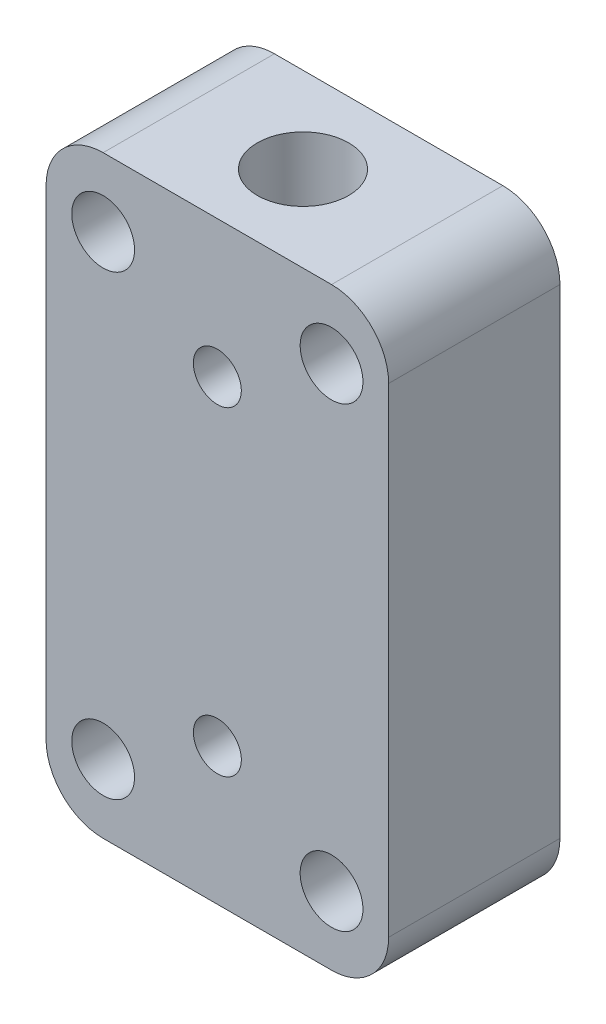
ISO-10303-21;
HEADER;
FILE_DESCRIPTION(('STEP AP214'),'2;1');
FILE_NAME('part.step','',(''),(''),'','','');
FILE_SCHEMA(('AUTOMOTIVE_DESIGN { 1 0 10303 214 1 1 1 1 }'));
ENDSEC;
DATA;
#1=APPLICATION_CONTEXT('core data for automotive mechanical design processes');
#2=APPLICATION_PROTOCOL_DEFINITION('international standard','automotive_design',2000,#1);
#3=PRODUCT_CONTEXT('',#1,'mechanical');
#4=PRODUCT('Part','Part','',(#3));
#5=PRODUCT_RELATED_PRODUCT_CATEGORY('part','',(#4));
#6=PRODUCT_DEFINITION_FORMATION('','',#4);
#7=PRODUCT_DEFINITION_CONTEXT('part definition',#1,'design');
#8=PRODUCT_DEFINITION('design','',#6,#7);
#9=PRODUCT_DEFINITION_SHAPE('','',#8);
#10=(LENGTH_UNIT() NAMED_UNIT(*) SI_UNIT(.MILLI.,.METRE.));
#11=(NAMED_UNIT(*) PLANE_ANGLE_UNIT() SI_UNIT($,.RADIAN.));
#12=(NAMED_UNIT(*) SI_UNIT($,.STERADIAN.) SOLID_ANGLE_UNIT());
#13=UNCERTAINTY_MEASURE_WITH_UNIT(LENGTH_MEASURE(1.E-05),#10,'distance_accuracy_value','');
#14=(GEOMETRIC_REPRESENTATION_CONTEXT(3) GLOBAL_UNCERTAINTY_ASSIGNED_CONTEXT((#13)) GLOBAL_UNIT_ASSIGNED_CONTEXT((#10,
#11,#12)) REPRESENTATION_CONTEXT('',''));
#15=CARTESIAN_POINT('',(0.,0.,0.));
#16=DIRECTION('',(0.,0.,1.));
#17=DIRECTION('',(1.,0.,0.));
#18=AXIS2_PLACEMENT_3D('',#15,#16,#17);
#19=CARTESIAN_POINT('',(0.,0.,15.));
#20=DIRECTION('',(1.,0.,0.));
#21=DIRECTION('',(0.,0.,-1.));
#22=AXIS2_PLACEMENT_3D('',#19,#20,#21);
#23=PLANE('',#22);
#24=DIRECTION('',(0.,-1.,0.));
#25=VECTOR('',#24,1.);
#26=CARTESIAN_POINT('',(0.,0.,0.));
#27=LINE('',#26,#25);
#28=CARTESIAN_POINT('',(0.,47.,0.));
#29=VERTEX_POINT('',#28);
#30=CARTESIAN_POINT('',(0.,5.,0.));
#31=VERTEX_POINT('',#30);
#32=EDGE_CURVE('E134',#29,#31,#27,.T.);
#33=ORIENTED_EDGE('',*,*,#32,.T.);
#34=DIRECTION('',(0.,0.,-1.));
#35=VECTOR('',#34,1.);
#36=CARTESIAN_POINT('',(0.,5.,15.));
#37=LINE('',#36,#35);
#38=CARTESIAN_POINT('',(0.,5.,15.));
#39=VERTEX_POINT('',#38);
#40=EDGE_CURVE('E161',#31,#39,#37,.F.);
#41=ORIENTED_EDGE('',*,*,#40,.T.);
#42=DIRECTION('',(0.,-1.,0.));
#43=VECTOR('',#42,1.);
#44=CARTESIAN_POINT('',(0.,0.,15.));
#45=LINE('',#44,#43);
#46=CARTESIAN_POINT('',(0.,47.,15.));
#47=VERTEX_POINT('',#46);
#48=EDGE_CURVE('E132',#47,#39,#45,.T.);
#49=ORIENTED_EDGE('',*,*,#48,.F.);
#50=DIRECTION('',(0.,0.,-1.));
#51=VECTOR('',#50,1.);
#52=CARTESIAN_POINT('',(0.,47.,15.));
#53=LINE('',#52,#51);
#54=EDGE_CURVE('E158',#47,#29,#53,.T.);
#55=ORIENTED_EDGE('',*,*,#54,.T.);
#56=EDGE_LOOP('',(#33,#41,#49,#55));
#57=FACE_BOUND('',#56,.T.);
#58=ADVANCED_FACE('F33',(#57),#23,.F.);
#59=CARTESIAN_POINT('',(0.,0.,15.));
#60=DIRECTION('',(0.,1.,0.));
#61=DIRECTION('',(0.,0.,1.));
#62=AXIS2_PLACEMENT_3D('',#59,#60,#61);
#63=PLANE('',#62);
#64=CARTESIAN_POINT('',(15.,0.,7.5));
#65=DIRECTION('',(0.,1.,0.));
#66=DIRECTION('',(0.,0.,1.));
#67=AXIS2_PLACEMENT_3D('',#64,#65,#66);
#68=CIRCLE('',#67,4.);
#69=CARTESIAN_POINT('',(15.,0.,11.5));
#70=VERTEX_POINT('',#69);
#71=EDGE_CURVE('E141',#70,#70,#68,.T.);
#72=ORIENTED_EDGE('',*,*,#71,.T.);
#73=EDGE_LOOP('',(#72));
#74=FACE_BOUND('',#73,.T.);
#75=DIRECTION('',(1.,0.,0.));
#76=VECTOR('',#75,1.);
#77=CARTESIAN_POINT('',(0.,0.,0.));
#78=LINE('',#77,#76);
#79=CARTESIAN_POINT('',(5.,0.,0.));
#80=VERTEX_POINT('',#79);
#81=CARTESIAN_POINT('',(25.,0.,0.));
#82=VERTEX_POINT('',#81);
#83=EDGE_CURVE('E130',#80,#82,#78,.T.);
#84=ORIENTED_EDGE('',*,*,#83,.T.);
#85=DIRECTION('',(0.,0.,-1.));
#86=VECTOR('',#85,1.);
#87=CARTESIAN_POINT('',(25.,0.,15.));
#88=LINE('',#87,#86);
#89=CARTESIAN_POINT('',(25.,0.,15.));
#90=VERTEX_POINT('',#89);
#91=EDGE_CURVE('E109',#82,#90,#88,.F.);
#92=ORIENTED_EDGE('',*,*,#91,.T.);
#93=DIRECTION('',(1.,0.,0.));
#94=VECTOR('',#93,1.);
#95=CARTESIAN_POINT('',(0.,0.,15.));
#96=LINE('',#95,#94);
#97=CARTESIAN_POINT('',(5.,0.,15.));
#98=VERTEX_POINT('',#97);
#99=EDGE_CURVE('E235',#98,#90,#96,.T.);
#100=ORIENTED_EDGE('',*,*,#99,.F.);
#101=DIRECTION('',(0.,0.,-1.));
#102=VECTOR('',#101,1.);
#103=CARTESIAN_POINT('',(5.,0.,15.));
#104=LINE('',#103,#102);
#105=EDGE_CURVE('E114',#98,#80,#104,.T.);
#106=ORIENTED_EDGE('',*,*,#105,.T.);
#107=EDGE_LOOP('',(#84,#92,#100,#106));
#108=FACE_BOUND('',#107,.T.);
#109=ADVANCED_FACE('F203',(#74,#108),#63,.F.);
#110=CARTESIAN_POINT('',(30.,0.,15.));
#111=DIRECTION('',(-1.,0.,0.));
#112=DIRECTION('',(0.,0.,1.));
#113=AXIS2_PLACEMENT_3D('',#110,#111,#112);
#114=PLANE('',#113);
#115=DIRECTION('',(0.,1.,0.));
#116=VECTOR('',#115,1.);
#117=CARTESIAN_POINT('',(30.,0.,15.));
#118=LINE('',#117,#116);
#119=CARTESIAN_POINT('',(30.,5.,15.));
#120=VERTEX_POINT('',#119);
#121=CARTESIAN_POINT('',(30.,47.,15.));
#122=VERTEX_POINT('',#121);
#123=EDGE_CURVE('E123',#120,#122,#118,.T.);
#124=ORIENTED_EDGE('',*,*,#123,.F.);
#125=DIRECTION('',(0.,0.,-1.));
#126=VECTOR('',#125,1.);
#127=CARTESIAN_POINT('',(30.,5.,15.));
#128=LINE('',#127,#126);
#129=CARTESIAN_POINT('',(30.,5.,0.));
#130=VERTEX_POINT('',#129);
#131=EDGE_CURVE('E108',#120,#130,#128,.T.);
#132=ORIENTED_EDGE('',*,*,#131,.T.);
#133=DIRECTION('',(0.,1.,0.));
#134=VECTOR('',#133,1.);
#135=CARTESIAN_POINT('',(30.,0.,0.));
#136=LINE('',#135,#134);
#137=CARTESIAN_POINT('',(30.,47.,0.));
#138=VERTEX_POINT('',#137);
#139=EDGE_CURVE('E121',#130,#138,#136,.T.);
#140=ORIENTED_EDGE('',*,*,#139,.T.);
#141=DIRECTION('',(0.,0.,-1.));
#142=VECTOR('',#141,1.);
#143=CARTESIAN_POINT('',(30.,47.,15.));
#144=LINE('',#143,#142);
#145=EDGE_CURVE('E125',#138,#122,#144,.F.);
#146=ORIENTED_EDGE('',*,*,#145,.T.);
#147=EDGE_LOOP('',(#124,#132,#140,#146));
#148=FACE_BOUND('',#147,.T.);
#149=ADVANCED_FACE('F120',(#148),#114,.F.);
#150=CARTESIAN_POINT('',(0.,52.,15.));
#151=DIRECTION('',(0.,-1.,0.));
#152=DIRECTION('',(0.,0.,-1.));
#153=AXIS2_PLACEMENT_3D('',#150,#151,#152);
#154=PLANE('',#153);
#155=CARTESIAN_POINT('',(15.,52.,7.5));
#156=DIRECTION('',(0.,-1.,0.));
#157=DIRECTION('',(0.,0.,-1.));
#158=AXIS2_PLACEMENT_3D('',#155,#156,#157);
#159=CIRCLE('',#158,4.);
#160=CARTESIAN_POINT('',(15.,52.,3.5));
#161=VERTEX_POINT('',#160);
#162=EDGE_CURVE('E138',#161,#161,#159,.T.);
#163=ORIENTED_EDGE('',*,*,#162,.T.);
#164=EDGE_LOOP('',(#163));
#165=FACE_BOUND('',#164,.T.);
#166=DIRECTION('',(-1.,0.,0.));
#167=VECTOR('',#166,1.);
#168=CARTESIAN_POINT('',(0.,52.,0.));
#169=LINE('',#168,#167);
#170=CARTESIAN_POINT('',(25.,52.,0.));
#171=VERTEX_POINT('',#170);
#172=CARTESIAN_POINT('',(5.,52.,0.));
#173=VERTEX_POINT('',#172);
#174=EDGE_CURVE('E129',#171,#173,#169,.T.);
#175=ORIENTED_EDGE('',*,*,#174,.T.);
#176=DIRECTION('',(0.,0.,-1.));
#177=VECTOR('',#176,1.);
#178=CARTESIAN_POINT('',(5.,52.,15.));
#179=LINE('',#178,#177);
#180=CARTESIAN_POINT('',(5.,52.,15.));
#181=VERTEX_POINT('',#180);
#182=EDGE_CURVE('E11',#173,#181,#179,.F.);
#183=ORIENTED_EDGE('',*,*,#182,.T.);
#184=DIRECTION('',(-1.,0.,0.));
#185=VECTOR('',#184,1.);
#186=CARTESIAN_POINT('',(0.,52.,15.));
#187=LINE('',#186,#185);
#188=CARTESIAN_POINT('',(25.,52.,15.));
#189=VERTEX_POINT('',#188);
#190=EDGE_CURVE('E142',#189,#181,#187,.T.);
#191=ORIENTED_EDGE('',*,*,#190,.F.);
#192=DIRECTION('',(0.,0.,-1.));
#193=VECTOR('',#192,1.);
#194=CARTESIAN_POINT('',(25.,52.,15.));
#195=LINE('',#194,#193);
#196=EDGE_CURVE('E46',#189,#171,#195,.T.);
#197=ORIENTED_EDGE('',*,*,#196,.T.);
#198=EDGE_LOOP('',(#175,#183,#191,#197));
#199=FACE_BOUND('',#198,.T.);
#200=ADVANCED_FACE('F246',(#165,#199),#154,.F.);
#201=CARTESIAN_POINT('',(0.,0.,15.));
#202=DIRECTION('',(0.,0.,-1.));
#203=DIRECTION('',(-1.,0.,0.));
#204=AXIS2_PLACEMENT_3D('',#201,#202,#203);
#205=PLANE('',#204);
#206=CARTESIAN_POINT('',(15.,12.,15.));
#207=DIRECTION('',(0.,0.,1.));
#208=DIRECTION('',(-1.,0.,0.));
#209=AXIS2_PLACEMENT_3D('',#206,#207,#208);
#210=CIRCLE('',#209,2.1);
#211=CARTESIAN_POINT('',(12.9,12.,15.));
#212=VERTEX_POINT('',#211);
#213=EDGE_CURVE('E292',#212,#212,#210,.T.);
#214=ORIENTED_EDGE('',*,*,#213,.F.);
#215=EDGE_LOOP('',(#214));
#216=FACE_BOUND('',#215,.T.);
#217=CARTESIAN_POINT('',(15.,40.,15.));
#218=DIRECTION('',(0.,0.,1.));
#219=DIRECTION('',(1.,0.,0.));
#220=AXIS2_PLACEMENT_3D('',#217,#218,#219);
#221=CIRCLE('',#220,2.1);
#222=CARTESIAN_POINT('',(17.1,40.,15.));
#223=VERTEX_POINT('',#222);
#224=EDGE_CURVE('E170',#223,#223,#221,.T.);
#225=ORIENTED_EDGE('',*,*,#224,.F.);
#226=EDGE_LOOP('',(#225));
#227=FACE_BOUND('',#226,.T.);
#228=CARTESIAN_POINT('',(25.,46.,15.));
#229=DIRECTION('',(0.,0.,1.));
#230=DIRECTION('',(-1.,0.,0.));
#231=AXIS2_PLACEMENT_3D('',#228,#229,#230);
#232=CIRCLE('',#231,2.75);
#233=CARTESIAN_POINT('',(22.25,46.,15.));
#234=VERTEX_POINT('',#233);
#235=EDGE_CURVE('E286',#234,#234,#232,.T.);
#236=ORIENTED_EDGE('',*,*,#235,.F.);
#237=EDGE_LOOP('',(#236));
#238=FACE_BOUND('',#237,.T.);
#239=CARTESIAN_POINT('',(25.,6.00000000000001,15.));
#240=DIRECTION('',(0.,0.,1.));
#241=DIRECTION('',(1.,0.,0.));
#242=AXIS2_PLACEMENT_3D('',#239,#240,#241);
#243=CIRCLE('',#242,2.75);
#244=CARTESIAN_POINT('',(27.75,6.00000000000001,15.));
#245=VERTEX_POINT('',#244);
#246=EDGE_CURVE('E282',#245,#245,#243,.T.);
#247=ORIENTED_EDGE('',*,*,#246,.F.);
#248=EDGE_LOOP('',(#247));
#249=FACE_BOUND('',#248,.T.);
#250=CARTESIAN_POINT('',(5.,6.00000000000001,15.));
#251=DIRECTION('',(0.,0.,1.));
#252=DIRECTION('',(-1.,0.,0.));
#253=AXIS2_PLACEMENT_3D('',#250,#251,#252);
#254=CIRCLE('',#253,2.75);
#255=CARTESIAN_POINT('',(2.25,6.00000000000001,15.));
#256=VERTEX_POINT('',#255);
#257=EDGE_CURVE('E169',#256,#256,#254,.T.);
#258=ORIENTED_EDGE('',*,*,#257,.F.);
#259=EDGE_LOOP('',(#258));
#260=FACE_BOUND('',#259,.T.);
#261=CARTESIAN_POINT('',(5.,46.,15.));
#262=DIRECTION('',(0.,0.,1.));
#263=DIRECTION('',(1.,0.,0.));
#264=AXIS2_PLACEMENT_3D('',#261,#262,#263);
#265=CIRCLE('',#264,2.75);
#266=CARTESIAN_POINT('',(7.75,46.,15.));
#267=VERTEX_POINT('',#266);
#268=EDGE_CURVE('E274',#267,#267,#265,.T.);
#269=ORIENTED_EDGE('',*,*,#268,.F.);
#270=EDGE_LOOP('',(#269));
#271=FACE_BOUND('',#270,.T.);
#272=ORIENTED_EDGE('',*,*,#99,.T.);
#273=CARTESIAN_POINT('',(25.,5.,15.));
#274=DIRECTION('',(0.,0.,-1.));
#275=DIRECTION('',(-1.,0.,0.));
#276=AXIS2_PLACEMENT_3D('',#273,#274,#275);
#277=CIRCLE('',#276,5.);
#278=EDGE_CURVE('E156',#90,#120,#277,.F.);
#279=ORIENTED_EDGE('',*,*,#278,.T.);
#280=ORIENTED_EDGE('',*,*,#123,.T.);
#281=CARTESIAN_POINT('',(25.,47.,15.));
#282=DIRECTION('',(0.,0.,-1.));
#283=DIRECTION('',(-1.,0.,0.));
#284=AXIS2_PLACEMENT_3D('',#281,#282,#283);
#285=CIRCLE('',#284,5.);
#286=EDGE_CURVE('E59',#122,#189,#285,.F.);
#287=ORIENTED_EDGE('',*,*,#286,.T.);
#288=ORIENTED_EDGE('',*,*,#190,.T.);
#289=CARTESIAN_POINT('',(5.,47.,15.));
#290=DIRECTION('',(0.,0.,-1.));
#291=DIRECTION('',(-1.,0.,0.));
#292=AXIS2_PLACEMENT_3D('',#289,#290,#291);
#293=CIRCLE('',#292,5.);
#294=EDGE_CURVE('E152',#181,#47,#293,.F.);
#295=ORIENTED_EDGE('',*,*,#294,.T.);
#296=ORIENTED_EDGE('',*,*,#48,.T.);
#297=CARTESIAN_POINT('',(5.,5.,15.));
#298=DIRECTION('',(0.,0.,-1.));
#299=DIRECTION('',(-1.,0.,0.));
#300=AXIS2_PLACEMENT_3D('',#297,#298,#299);
#301=CIRCLE('',#300,5.);
#302=EDGE_CURVE('E154',#39,#98,#301,.F.);
#303=ORIENTED_EDGE('',*,*,#302,.T.);
#304=EDGE_LOOP('',(#272,#279,#280,#287,#288,#295,#296,#303));
#305=FACE_BOUND('',#304,.T.);
#306=ADVANCED_FACE('F231',(#216,#227,#238,#249,#260,#271,#305),#205,.F.);
#307=CARTESIAN_POINT('',(0.,0.,0.));
#308=DIRECTION('',(0.,0.,-1.));
#309=DIRECTION('',(-1.,0.,0.));
#310=AXIS2_PLACEMENT_3D('',#307,#308,#309);
#311=PLANE('',#310);
#312=CARTESIAN_POINT('',(25.,46.,0.));
#313=DIRECTION('',(0.,0.,1.));
#314=DIRECTION('',(-1.,0.,0.));
#315=AXIS2_PLACEMENT_3D('',#312,#313,#314);
#316=CIRCLE('',#315,2.75);
#317=CARTESIAN_POINT('',(22.25,46.,0.));
#318=VERTEX_POINT('',#317);
#319=EDGE_CURVE('E263',#318,#318,#316,.T.);
#320=ORIENTED_EDGE('',*,*,#319,.T.);
#321=EDGE_LOOP('',(#320));
#322=FACE_BOUND('',#321,.T.);
#323=CARTESIAN_POINT('',(25.,6.00000000000001,0.));
#324=DIRECTION('',(0.,0.,1.));
#325=DIRECTION('',(1.,0.,0.));
#326=AXIS2_PLACEMENT_3D('',#323,#324,#325);
#327=CIRCLE('',#326,2.75);
#328=CARTESIAN_POINT('',(27.75,6.00000000000001,0.));
#329=VERTEX_POINT('',#328);
#330=EDGE_CURVE('E267',#329,#329,#327,.T.);
#331=ORIENTED_EDGE('',*,*,#330,.T.);
#332=EDGE_LOOP('',(#331));
#333=FACE_BOUND('',#332,.T.);
#334=CARTESIAN_POINT('',(5.,6.00000000000001,0.));
#335=DIRECTION('',(0.,0.,1.));
#336=DIRECTION('',(-1.,0.,0.));
#337=AXIS2_PLACEMENT_3D('',#334,#335,#336);
#338=CIRCLE('',#337,2.75);
#339=CARTESIAN_POINT('',(2.25,6.00000000000001,0.));
#340=VERTEX_POINT('',#339);
#341=EDGE_CURVE('E271',#340,#340,#338,.T.);
#342=ORIENTED_EDGE('',*,*,#341,.T.);
#343=EDGE_LOOP('',(#342));
#344=FACE_BOUND('',#343,.T.);
#345=CARTESIAN_POINT('',(5.,46.,0.));
#346=DIRECTION('',(0.,0.,1.));
#347=DIRECTION('',(1.,0.,0.));
#348=AXIS2_PLACEMENT_3D('',#345,#346,#347);
#349=CIRCLE('',#348,2.75);
#350=CARTESIAN_POINT('',(7.75,46.,0.));
#351=VERTEX_POINT('',#350);
#352=EDGE_CURVE('E273',#351,#351,#349,.T.);
#353=ORIENTED_EDGE('',*,*,#352,.T.);
#354=EDGE_LOOP('',(#353));
#355=FACE_BOUND('',#354,.T.);
#356=ORIENTED_EDGE('',*,*,#139,.F.);
#357=CARTESIAN_POINT('',(25.,5.,0.));
#358=DIRECTION('',(0.,0.,-1.));
#359=DIRECTION('',(-1.,0.,0.));
#360=AXIS2_PLACEMENT_3D('',#357,#358,#359);
#361=CIRCLE('',#360,5.);
#362=EDGE_CURVE('E104',#130,#82,#361,.T.);
#363=ORIENTED_EDGE('',*,*,#362,.T.);
#364=ORIENTED_EDGE('',*,*,#83,.F.);
#365=CARTESIAN_POINT('',(5.,5.,0.));
#366=DIRECTION('',(0.,0.,-1.));
#367=DIRECTION('',(-1.,0.,0.));
#368=AXIS2_PLACEMENT_3D('',#365,#366,#367);
#369=CIRCLE('',#368,5.);
#370=EDGE_CURVE('E115',#80,#31,#369,.T.);
#371=ORIENTED_EDGE('',*,*,#370,.T.);
#372=ORIENTED_EDGE('',*,*,#32,.F.);
#373=CARTESIAN_POINT('',(5.,47.,0.));
#374=DIRECTION('',(0.,0.,-1.));
#375=DIRECTION('',(-1.,0.,0.));
#376=AXIS2_PLACEMENT_3D('',#373,#374,#375);
#377=CIRCLE('',#376,5.);
#378=EDGE_CURVE('E145',#29,#173,#377,.T.);
#379=ORIENTED_EDGE('',*,*,#378,.T.);
#380=ORIENTED_EDGE('',*,*,#174,.F.);
#381=CARTESIAN_POINT('',(25.,47.,0.));
#382=DIRECTION('',(0.,0.,-1.));
#383=DIRECTION('',(-1.,0.,0.));
#384=AXIS2_PLACEMENT_3D('',#381,#382,#383);
#385=CIRCLE('',#384,5.);
#386=EDGE_CURVE('E124',#171,#138,#385,.T.);
#387=ORIENTED_EDGE('',*,*,#386,.T.);
#388=EDGE_LOOP('',(#356,#363,#364,#371,#372,#379,#380,#387));
#389=FACE_BOUND('',#388,.T.);
#390=ADVANCED_FACE('F127',(#322,#333,#344,#355,#389),#311,.T.);
#391=CARTESIAN_POINT('',(15.,0.,7.5));
#392=DIRECTION('',(0.,1.,0.));
#393=DIRECTION('',(0.,0.,1.));
#394=AXIS2_PLACEMENT_3D('',#391,#392,#393);
#395=CYLINDRICAL_SURFACE('',#394,4.);
#396=CARTESIAN_POINT('',(15.,9.89999999999999,11.5));
#397=CARTESIAN_POINT('',(15.1097252395222,9.90000850817597,11.4999926428786));
#398=CARTESIAN_POINT('',(15.219566121798,9.90865077782146,11.4954373562782));
#399=CARTESIAN_POINT('',(15.4359563328533,9.94282051483627,11.4776605655973));
#400=CARTESIAN_POINT('',(15.5424999670262,9.96837565544407,11.4644248587299));
#401=CARTESIAN_POINT('',(15.7488477672566,10.03507317958,11.4306635626211));
#402=CARTESIAN_POINT('',(15.848677088492,10.0761530680352,11.4101672216118));
#403=CARTESIAN_POINT('',(16.0398542926017,10.17238731973,11.3637281483345));
#404=CARTESIAN_POINT('',(16.1312023073436,10.2275414640927,11.3377855007663));
#405=CARTESIAN_POINT('',(16.3094718289169,10.35439519621,11.280819630101));
#406=CARTESIAN_POINT('',(16.395724279159,10.4269345505642,11.2495762633363));
#407=CARTESIAN_POINT('',(16.5554650500713,10.5846743160937,11.1861806966524));
#408=CARTESIAN_POINT('',(16.6289425654236,10.6698853333148,11.1540277538604));
#409=CARTESIAN_POINT('',(16.7675321072039,10.8594758358185,11.0891760227479));
#410=CARTESIAN_POINT('',(16.831345969498,10.9648808886258,11.0566765113324));
#411=CARTESIAN_POINT('',(16.940078009522,11.186778987405,10.9985599220822));
#412=CARTESIAN_POINT('',(16.9850105598362,11.3032635164658,10.9729376146597));
#413=CARTESIAN_POINT('',(17.0516277897332,11.5367308980096,10.9339831229548));
#414=CARTESIAN_POINT('',(17.0745813337518,11.653234904302,10.9199873312242));
#415=CARTESIAN_POINT('',(17.1004206577409,11.8892080386553,10.9041872198482));
#416=CARTESIAN_POINT('',(17.1033302560727,12.0086734780635,10.902368430258));
#417=CARTESIAN_POINT('',(17.0899257568675,12.229764140994,10.9106056313839));
#418=CARTESIAN_POINT('',(17.0761575200203,12.3316176468463,10.9190893964975));
#419=CARTESIAN_POINT('',(17.0342448200542,12.5312801486396,10.9441891657529));
#420=CARTESIAN_POINT('',(17.0060949114543,12.6290875974054,10.960808250155));
#421=CARTESIAN_POINT('',(16.9357620172503,12.8206605586645,11.0006401733788));
#422=CARTESIAN_POINT('',(16.8932738651597,12.9142831736114,11.023994639943));
#423=CARTESIAN_POINT('',(16.795716667553,13.0935387455401,11.0746917771419));
#424=CARTESIAN_POINT('',(16.7406420030435,13.179168109977,11.1020362270467));
#425=CARTESIAN_POINT('',(16.6103939818052,13.3527804224098,11.1623044440403));
#426=CARTESIAN_POINT('',(16.5334784250171,13.4393772694657,11.1954697283091));
#427=CARTESIAN_POINT('',(16.3661646278118,13.5990549205066,11.2605392698717));
#428=CARTESIAN_POINT('',(16.2757586855825,13.6721279498543,11.2924427935636));
#429=CARTESIAN_POINT('',(16.07766804033,13.8065821206846,11.353563532607));
#430=CARTESIAN_POINT('',(15.9692989194435,13.8670784688117,11.3825299847447));
#431=CARTESIAN_POINT('',(15.7420234421849,13.968462670715,11.4322877259573));
#432=CARTESIAN_POINT('',(15.6231263407839,14.0093675481865,11.4530861097046));
#433=CARTESIAN_POINT('',(15.3893969746267,14.0667726791061,11.4825873442618));
#434=CARTESIAN_POINT('',(15.2751308230942,14.0851069092832,11.492195077283));
#435=CARTESIAN_POINT('',(15.0447608666751,14.1026931490091,11.5014066976739));
#436=CARTESIAN_POINT('',(14.9286581079261,14.1019556566101,11.5010160886439));
#437=CARTESIAN_POINT('',(14.708720921447,14.0823727421171,11.4907672868362));
#438=CARTESIAN_POINT('',(14.604700324514,14.0651137704503,11.4817385949971));
#439=CARTESIAN_POINT('',(14.4012718178038,14.0155612495609,11.4562654752731));
#440=CARTESIAN_POINT('',(14.3018643959573,13.9832661139466,11.4398202649135));
#441=CARTESIAN_POINT('',(14.1074466726723,13.9038557461813,11.4004422108233));
#442=CARTESIAN_POINT('',(14.0126179666209,13.8563769257327,11.3773517638823));
#443=CARTESIAN_POINT('',(13.8319884339727,13.7483808249652,11.3268210303281));
#444=CARTESIAN_POINT('',(13.7461912486693,13.687858315483,11.2993790003517));
#445=CARTESIAN_POINT('',(13.5764459783523,13.5481654461086,11.2393084994505));
#446=CARTESIAN_POINT('',(13.4936462476382,13.4677018611849,11.2064382452969));
#447=CARTESIAN_POINT('',(13.3421505453714,13.2941486211428,11.1412020641859));
#448=CARTESIAN_POINT('',(13.2734668054453,13.201048131041,11.1088365968813));
#449=CARTESIAN_POINT('',(13.148025922868,12.9976644098409,11.0461829127588));
#450=CARTESIAN_POINT('',(13.092279415783,12.8866717643729,11.0161500347792));
#451=CARTESIAN_POINT('',(13.0008362256602,12.6548387740357,10.9649855830167));
#452=CARTESIAN_POINT('',(12.9651115258365,12.5340124622389,10.9438415813214));
#453=CARTESIAN_POINT('',(12.9182077120598,12.2985095047388,10.915673357382));
#454=CARTESIAN_POINT('',(12.9049678720206,12.1843889687674,10.9074693970288));
#455=CARTESIAN_POINT('',(12.8973559750131,11.9553069155619,10.9027813251837));
#456=CARTESIAN_POINT('',(12.9029724464797,11.8403459520825,10.9062900880456));
#457=CARTESIAN_POINT('',(12.9309426803359,11.6268303856778,10.9233328006087));
#458=CARTESIAN_POINT('',(12.9513041342155,11.5279056644871,10.9356715106149));
#459=CARTESIAN_POINT('',(13.0055404655253,11.3350391859877,10.9674360798436));
#460=CARTESIAN_POINT('',(13.0394201432366,11.2410992121876,10.9868644563759));
#461=CARTESIAN_POINT('',(13.1221729199085,11.054003398743,11.0321553950175));
#462=CARTESIAN_POINT('',(13.1718830279389,10.9613023084227,11.0583561513698));
#463=CARTESIAN_POINT('',(13.2840281085148,10.7849376907818,11.1137728301922));
#464=CARTESIAN_POINT('',(13.3464699251158,10.7012790614917,11.1429903701767));
#465=CARTESIAN_POINT('',(13.4924350063842,10.5332763528659,11.2059946066124));
#466=CARTESIAN_POINT('',(13.5776810131955,10.4504464902337,11.2398529843817));
#467=CARTESIAN_POINT('',(13.7616087291921,10.2998426080544,11.3047226129078));
#468=CARTESIAN_POINT('',(13.8602986555367,10.2320778637662,11.3357321028129));
#469=CARTESIAN_POINT('',(14.0712774135892,10.1125663509588,11.3922446343073));
#470=CARTESIAN_POINT('',(14.1837935253637,10.0611569893936,11.4176287647099));
#471=CARTESIAN_POINT('',(14.3588982004883,9.99929208684426,11.4487374572772));
#472=CARTESIAN_POINT('',(14.4182816789505,9.98121864301115,11.4579421217688));
#473=CARTESIAN_POINT('',(14.5387271548194,9.95034560887322,11.473777076514));
#474=CARTESIAN_POINT('',(14.5997881757137,9.93754301695128,11.48040883185));
#475=CARTESIAN_POINT('',(14.7172228228,9.91835748923452,11.4903853496153));
#476=CARTESIAN_POINT('',(14.7734952539896,9.91148289088821,11.4939811717507));
#477=CARTESIAN_POINT('',(14.8865014673951,9.90230190074296,11.498790423324));
#478=CARTESIAN_POINT('',(14.9432352586255,9.89999559842009,11.5000038060987));
#479=CARTESIAN_POINT('',(15.,9.89999999999999,11.5));
#480=B_SPLINE_CURVE_WITH_KNOTS('',3,(#396,#397,#398,#399,#400,#401,#402,#403,#404,#405,#406,
#407,#408,#409,#410,#411,#412,#413,#414,#415,#416,#417,#418,#419,#420,#421,#422,#423,#424,#425,
#426,#427,#428,#429,#430,#431,#432,#433,#434,#435,#436,#437,#438,#439,#440,#441,#442,#443,#444,
#445,#446,#447,#448,#449,#450,#451,#452,#453,#454,#455,#456,#457,#458,#459,#460,#461,#462,#463,
#464,#465,#466,#467,#468,#469,#470,#471,#472,#473,#474,#475,#476,#477,#478,#479),.UNSPECIFIED.,
.T.,.F.,(4,2,2,2,2,2,2,2,2,2,2,2,2,2,2,2,2,2,2,2,2,2,2,2,2,2,2,2,2,2,2,2,2,2,2,2,2,2,2,2,2,4),
(0.,0.328955388056856,0.658450355809531,0.986632826787795,1.31481019432104,1.66422610127769,
2.01393612903032,2.3943054227538,2.77438464995628,3.13089429519635,3.48698022433372,
3.79492330354659,4.1029830689429,4.41806287071791,4.73328360921356,5.09317488258759,
5.45327241364169,5.83355153918036,6.21349962504738,6.55994297045683,6.90619561978193,
7.2222202700175,7.53827827001647,7.86255611827311,8.18696421086292,8.54557019619714,
8.90448561862085,9.285779463906,9.66653841880977,10.0100186118085,10.3532898805348,
10.6572136356427,10.9612454093543,11.2851996834104,11.6093285635883,11.9784125341219,
12.347723115996,12.7242211787441,12.9122308814786,13.1001333688401,13.2703102751049,
13.4404905144749),.UNSPECIFIED.);
#481=CARTESIAN_POINT('',(15.,9.89999999999999,11.5));
#482=VERTEX_POINT('',#481);
#483=EDGE_CURVE('E37',#482,#482,#480,.T.);
#484=ORIENTED_EDGE('',*,*,#483,.T.);
#485=EDGE_LOOP('',(#484));
#486=FACE_BOUND('',#485,.T.);
#487=CARTESIAN_POINT('',(15.,37.9,11.5));
#488=CARTESIAN_POINT('',(15.1097252395222,37.900008508176,11.4999926428786));
#489=CARTESIAN_POINT('',(15.219566121798,37.9086507778215,11.4954373562782));
#490=CARTESIAN_POINT('',(15.4359563328533,37.9428205148363,11.4776605655973));
#491=CARTESIAN_POINT('',(15.5424999670262,37.9683756554441,11.4644248587299));
#492=CARTESIAN_POINT('',(15.7488477672566,38.03507317958,11.4306635626211));
#493=CARTESIAN_POINT('',(15.848677088492,38.0761530680352,11.4101672216118));
#494=CARTESIAN_POINT('',(16.0398542926017,38.17238731973,11.3637281483345));
#495=CARTESIAN_POINT('',(16.1312023073436,38.2275414640927,11.3377855007663));
#496=CARTESIAN_POINT('',(16.3094718289169,38.35439519621,11.280819630101));
#497=CARTESIAN_POINT('',(16.395724279159,38.4269345505642,11.2495762633363));
#498=CARTESIAN_POINT('',(16.5554650500713,38.5846743160937,11.1861806966524));
#499=CARTESIAN_POINT('',(16.6289425654236,38.6698853333148,11.1540277538604));
#500=CARTESIAN_POINT('',(16.7675321072039,38.8594758358185,11.0891760227479));
#501=CARTESIAN_POINT('',(16.831345969498,38.9648808886258,11.0566765113324));
#502=CARTESIAN_POINT('',(16.940078009522,39.186778987405,10.9985599220822));
#503=CARTESIAN_POINT('',(16.9850105598362,39.3032635164658,10.9729376146597));
#504=CARTESIAN_POINT('',(17.0516277897332,39.5367308980096,10.9339831229548));
#505=CARTESIAN_POINT('',(17.0745813337518,39.653234904302,10.9199873312242));
#506=CARTESIAN_POINT('',(17.1004206577409,39.8892080386554,10.9041872198482));
#507=CARTESIAN_POINT('',(17.1033302560727,40.0086734780635,10.902368430258));
#508=CARTESIAN_POINT('',(17.0899257568675,40.229764140994,10.9106056313839));
#509=CARTESIAN_POINT('',(17.0761575200203,40.3316176468463,10.9190893964975));
#510=CARTESIAN_POINT('',(17.0342448200542,40.5312801486396,10.9441891657529));
#511=CARTESIAN_POINT('',(17.0060949114543,40.6290875974054,10.960808250155));
#512=CARTESIAN_POINT('',(16.9357620172503,40.8206605586645,11.0006401733788));
#513=CARTESIAN_POINT('',(16.8932738651597,40.9142831736114,11.023994639943));
#514=CARTESIAN_POINT('',(16.795716667553,41.0935387455401,11.0746917771419));
#515=CARTESIAN_POINT('',(16.7406420030435,41.179168109977,11.1020362270467));
#516=CARTESIAN_POINT('',(16.6103939818052,41.3527804224098,11.1623044440403));
#517=CARTESIAN_POINT('',(16.5334784250171,41.4393772694657,11.1954697283091));
#518=CARTESIAN_POINT('',(16.3661646278117,41.5990549205067,11.2605392698717));
#519=CARTESIAN_POINT('',(16.2757586855825,41.6721279498543,11.2924427935636));
#520=CARTESIAN_POINT('',(16.07766804033,41.8065821206846,11.353563532607));
#521=CARTESIAN_POINT('',(15.9692989194435,41.8670784688117,11.3825299847447));
#522=CARTESIAN_POINT('',(15.7420234421849,41.968462670715,11.4322877259573));
#523=CARTESIAN_POINT('',(15.6231263407839,42.0093675481865,11.4530861097046));
#524=CARTESIAN_POINT('',(15.3893969746267,42.0667726791061,11.4825873442618));
#525=CARTESIAN_POINT('',(15.2751308230942,42.0851069092832,11.492195077283));
#526=CARTESIAN_POINT('',(15.0447608666751,42.1026931490091,11.5014066976739));
#527=CARTESIAN_POINT('',(14.9286581079261,42.1019556566101,11.5010160886439));
#528=CARTESIAN_POINT('',(14.708720921447,42.0823727421171,11.4907672868362));
#529=CARTESIAN_POINT('',(14.604700324514,42.0651137704503,11.4817385949971));
#530=CARTESIAN_POINT('',(14.4012718178038,42.0155612495609,11.4562654752731));
#531=CARTESIAN_POINT('',(14.3018643959573,41.9832661139466,11.4398202649135));
#532=CARTESIAN_POINT('',(14.1074466726723,41.9038557461813,11.4004422108233));
#533=CARTESIAN_POINT('',(14.0126179666209,41.8563769257327,11.3773517638823));
#534=CARTESIAN_POINT('',(13.8319884339727,41.7483808249652,11.3268210303281));
#535=CARTESIAN_POINT('',(13.7461912486693,41.687858315483,11.2993790003517));
#536=CARTESIAN_POINT('',(13.5764459783523,41.5481654461086,11.2393084994505));
#537=CARTESIAN_POINT('',(13.4936462476382,41.4677018611849,11.2064382452969));
#538=CARTESIAN_POINT('',(13.3421505453714,41.2941486211428,11.1412020641859));
#539=CARTESIAN_POINT('',(13.2734668054453,41.201048131041,11.1088365968813));
#540=CARTESIAN_POINT('',(13.148025922868,40.9976644098409,11.0461829127588));
#541=CARTESIAN_POINT('',(13.092279415783,40.8866717643729,11.0161500347792));
#542=CARTESIAN_POINT('',(13.0008362256602,40.6548387740357,10.9649855830167));
#543=CARTESIAN_POINT('',(12.9651115258365,40.5340124622389,10.9438415813214));
#544=CARTESIAN_POINT('',(12.9182077120598,40.2985095047388,10.915673357382));
#545=CARTESIAN_POINT('',(12.9049678720206,40.1843889687674,10.9074693970288));
#546=CARTESIAN_POINT('',(12.897355975013,39.9553069155618,10.9027813251837));
#547=CARTESIAN_POINT('',(12.9029724464797,39.8403459520825,10.9062900880456));
#548=CARTESIAN_POINT('',(12.9309426803359,39.6268303856778,10.9233328006087));
#549=CARTESIAN_POINT('',(12.9513041342155,39.5279056644871,10.9356715106149));
#550=CARTESIAN_POINT('',(13.0055404655253,39.3350391859877,10.9674360798436));
#551=CARTESIAN_POINT('',(13.0394201432366,39.2410992121876,10.9868644563759));
#552=CARTESIAN_POINT('',(13.1221729199085,39.054003398743,11.0321553950175));
#553=CARTESIAN_POINT('',(13.1718830279389,38.9613023084227,11.0583561513698));
#554=CARTESIAN_POINT('',(13.2840281085148,38.7849376907818,11.1137728301922));
#555=CARTESIAN_POINT('',(13.3464699251158,38.7012790614917,11.1429903701767));
#556=CARTESIAN_POINT('',(13.4924350063842,38.5332763528659,11.2059946066124));
#557=CARTESIAN_POINT('',(13.5776810131955,38.4504464902337,11.2398529843817));
#558=CARTESIAN_POINT('',(13.7616087291921,38.2998426080544,11.3047226129078));
#559=CARTESIAN_POINT('',(13.8602986555368,38.2320778637662,11.3357321028129));
#560=CARTESIAN_POINT('',(14.0712774135892,38.1125663509588,11.3922446343073));
#561=CARTESIAN_POINT('',(14.1837935253637,38.0611569893936,11.4176287647099));
#562=CARTESIAN_POINT('',(14.3588982004883,37.9992920868443,11.4487374572772));
#563=CARTESIAN_POINT('',(14.4182816789505,37.9812186430111,11.4579421217688));
#564=CARTESIAN_POINT('',(14.5387271548194,37.9503456088732,11.473777076514));
#565=CARTESIAN_POINT('',(14.5997881757137,37.9375430169513,11.48040883185));
#566=CARTESIAN_POINT('',(14.7172228228,37.9183574892345,11.4903853496153));
#567=CARTESIAN_POINT('',(14.7734952539896,37.9114828908882,11.4939811717507));
#568=CARTESIAN_POINT('',(14.8865014673951,37.902301900743,11.498790423324));
#569=CARTESIAN_POINT('',(14.9432352586255,37.8999955984201,11.5000038060987));
#570=CARTESIAN_POINT('',(15.,37.9,11.5));
#571=B_SPLINE_CURVE_WITH_KNOTS('',3,(#487,#488,#489,#490,#491,#492,#493,#494,#495,#496,#497,
#498,#499,#500,#501,#502,#503,#504,#505,#506,#507,#508,#509,#510,#511,#512,#513,#514,#515,#516,
#517,#518,#519,#520,#521,#522,#523,#524,#525,#526,#527,#528,#529,#530,#531,#532,#533,#534,#535,
#536,#537,#538,#539,#540,#541,#542,#543,#544,#545,#546,#547,#548,#549,#550,#551,#552,#553,#554,
#555,#556,#557,#558,#559,#560,#561,#562,#563,#564,#565,#566,#567,#568,#569,#570),.UNSPECIFIED.,
.T.,.F.,(4,2,2,2,2,2,2,2,2,2,2,2,2,2,2,2,2,2,2,2,2,2,2,2,2,2,2,2,2,2,2,2,2,2,2,2,2,2,2,2,2,4),
(0.,0.328955388056857,0.658450355809535,0.986632826787794,1.31481019432104,1.66422610127769,
2.01393612903032,2.3943054227538,2.77438464995627,3.13089429519635,3.48698022433373,
3.7949233035466,4.10298306894292,4.41806287071792,4.73328360921357,5.09317488258761,
5.45327241364171,5.83355153918037,6.21349962504739,6.55994297045685,6.90619561978194,
7.22222027001752,7.53827827001649,7.86255611827312,8.18696421086294,8.54557019619715,
8.90448561862087,9.28577946390603,9.66653841880978,10.0100186118085,10.3532898805348,
10.6572136356427,10.9612454093544,11.2851996834104,11.6093285635883,11.9784125341219,
12.3477231159961,12.7242211787441,12.9122308814787,13.1001333688401,13.270310275105,
13.4404905144749),.UNSPECIFIED.);
#572=CARTESIAN_POINT('',(15.,37.9,11.5));
#573=VERTEX_POINT('',#572);
#574=EDGE_CURVE('E164',#573,#573,#571,.T.);
#575=ORIENTED_EDGE('',*,*,#574,.T.);
#576=EDGE_LOOP('',(#575));
#577=FACE_BOUND('',#576,.T.);
#578=ORIENTED_EDGE('',*,*,#71,.F.);
#579=EDGE_LOOP('',(#578));
#580=FACE_BOUND('',#579,.T.);
#581=ORIENTED_EDGE('',*,*,#162,.F.);
#582=EDGE_LOOP('',(#581));
#583=FACE_BOUND('',#582,.T.);
#584=ADVANCED_FACE('F171',(#486,#577,#580,#583),#395,.F.);
#585=CARTESIAN_POINT('',(5.,46.,0.));
#586=DIRECTION('',(0.,0.,1.));
#587=DIRECTION('',(1.,0.,0.));
#588=AXIS2_PLACEMENT_3D('',#585,#586,#587);
#589=CYLINDRICAL_SURFACE('',#588,2.75);
#590=ORIENTED_EDGE('',*,*,#352,.F.);
#591=EDGE_LOOP('',(#590));
#592=FACE_BOUND('',#591,.T.);
#593=ORIENTED_EDGE('',*,*,#268,.T.);
#594=EDGE_LOOP('',(#593));
#595=FACE_BOUND('',#594,.T.);
#596=ADVANCED_FACE('F192',(#592,#595),#589,.F.);
#597=CARTESIAN_POINT('',(5.,6.00000000000001,0.));
#598=DIRECTION('',(0.,0.,1.));
#599=DIRECTION('',(1.,0.,0.));
#600=AXIS2_PLACEMENT_3D('',#597,#598,#599);
#601=CYLINDRICAL_SURFACE('',#600,2.75);
#602=ORIENTED_EDGE('',*,*,#341,.F.);
#603=EDGE_LOOP('',(#602));
#604=FACE_BOUND('',#603,.T.);
#605=ORIENTED_EDGE('',*,*,#257,.T.);
#606=EDGE_LOOP('',(#605));
#607=FACE_BOUND('',#606,.T.);
#608=ADVANCED_FACE('F189',(#604,#607),#601,.F.);
#609=CARTESIAN_POINT('',(25.,6.00000000000001,0.));
#610=DIRECTION('',(0.,0.,1.));
#611=DIRECTION('',(1.,0.,0.));
#612=AXIS2_PLACEMENT_3D('',#609,#610,#611);
#613=CYLINDRICAL_SURFACE('',#612,2.75);
#614=ORIENTED_EDGE('',*,*,#330,.F.);
#615=EDGE_LOOP('',(#614));
#616=FACE_BOUND('',#615,.T.);
#617=ORIENTED_EDGE('',*,*,#246,.T.);
#618=EDGE_LOOP('',(#617));
#619=FACE_BOUND('',#618,.T.);
#620=ADVANCED_FACE('F185',(#616,#619),#613,.F.);
#621=CARTESIAN_POINT('',(25.,46.,0.));
#622=DIRECTION('',(0.,0.,1.));
#623=DIRECTION('',(1.,0.,0.));
#624=AXIS2_PLACEMENT_3D('',#621,#622,#623);
#625=CYLINDRICAL_SURFACE('',#624,2.75);
#626=ORIENTED_EDGE('',*,*,#319,.F.);
#627=EDGE_LOOP('',(#626));
#628=FACE_BOUND('',#627,.T.);
#629=ORIENTED_EDGE('',*,*,#235,.T.);
#630=EDGE_LOOP('',(#629));
#631=FACE_BOUND('',#630,.T.);
#632=ADVANCED_FACE('F182',(#628,#631),#625,.F.);
#633=CARTESIAN_POINT('',(25.,5.,15.));
#634=DIRECTION('',(0.,0.,-1.));
#635=DIRECTION('',(-1.,0.,0.));
#636=AXIS2_PLACEMENT_3D('',#633,#634,#635);
#637=CYLINDRICAL_SURFACE('',#636,5.);
#638=ORIENTED_EDGE('',*,*,#278,.F.);
#639=ORIENTED_EDGE('',*,*,#91,.F.);
#640=ORIENTED_EDGE('',*,*,#362,.F.);
#641=ORIENTED_EDGE('',*,*,#131,.F.);
#642=EDGE_LOOP('',(#638,#639,#640,#641));
#643=FACE_BOUND('',#642,.T.);
#644=ADVANCED_FACE('F107',(#643),#637,.T.);
#645=CARTESIAN_POINT('',(5.,5.,15.));
#646=DIRECTION('',(0.,0.,-1.));
#647=DIRECTION('',(-1.,0.,0.));
#648=AXIS2_PLACEMENT_3D('',#645,#646,#647);
#649=CYLINDRICAL_SURFACE('',#648,5.);
#650=ORIENTED_EDGE('',*,*,#302,.F.);
#651=ORIENTED_EDGE('',*,*,#40,.F.);
#652=ORIENTED_EDGE('',*,*,#370,.F.);
#653=ORIENTED_EDGE('',*,*,#105,.F.);
#654=EDGE_LOOP('',(#650,#651,#652,#653));
#655=FACE_BOUND('',#654,.T.);
#656=ADVANCED_FACE('F216',(#655),#649,.T.);
#657=CARTESIAN_POINT('',(5.,47.,15.));
#658=DIRECTION('',(0.,0.,-1.));
#659=DIRECTION('',(-1.,0.,0.));
#660=AXIS2_PLACEMENT_3D('',#657,#658,#659);
#661=CYLINDRICAL_SURFACE('',#660,5.);
#662=ORIENTED_EDGE('',*,*,#294,.F.);
#663=ORIENTED_EDGE('',*,*,#182,.F.);
#664=ORIENTED_EDGE('',*,*,#378,.F.);
#665=ORIENTED_EDGE('',*,*,#54,.F.);
#666=EDGE_LOOP('',(#662,#663,#664,#665));
#667=FACE_BOUND('',#666,.T.);
#668=ADVANCED_FACE('F218',(#667),#661,.T.);
#669=CARTESIAN_POINT('',(25.,47.,15.));
#670=DIRECTION('',(0.,0.,-1.));
#671=DIRECTION('',(-1.,0.,0.));
#672=AXIS2_PLACEMENT_3D('',#669,#670,#671);
#673=CYLINDRICAL_SURFACE('',#672,5.);
#674=ORIENTED_EDGE('',*,*,#286,.F.);
#675=ORIENTED_EDGE('',*,*,#145,.F.);
#676=ORIENTED_EDGE('',*,*,#386,.F.);
#677=ORIENTED_EDGE('',*,*,#196,.F.);
#678=EDGE_LOOP('',(#674,#675,#676,#677));
#679=FACE_BOUND('',#678,.T.);
#680=ADVANCED_FACE('F35',(#679),#673,.T.);
#681=CARTESIAN_POINT('',(15.,40.,5.));
#682=DIRECTION('',(0.,0.,1.));
#683=DIRECTION('',(1.,0.,0.));
#684=AXIS2_PLACEMENT_3D('',#681,#682,#683);
#685=CYLINDRICAL_SURFACE('',#684,2.1);
#686=ORIENTED_EDGE('',*,*,#224,.T.);
#687=EDGE_LOOP('',(#686));
#688=FACE_BOUND('',#687,.T.);
#689=ORIENTED_EDGE('',*,*,#574,.F.);
#690=EDGE_LOOP('',(#689));
#691=FACE_BOUND('',#690,.T.);
#692=ADVANCED_FACE('F175',(#688,#691),#685,.F.);
#693=CARTESIAN_POINT('',(15.,12.,5.));
#694=DIRECTION('',(0.,0.,1.));
#695=DIRECTION('',(1.,0.,0.));
#696=AXIS2_PLACEMENT_3D('',#693,#694,#695);
#697=CYLINDRICAL_SURFACE('',#696,2.1);
#698=ORIENTED_EDGE('',*,*,#213,.T.);
#699=EDGE_LOOP('',(#698));
#700=FACE_BOUND('',#699,.T.);
#701=ORIENTED_EDGE('',*,*,#483,.F.);
#702=EDGE_LOOP('',(#701));
#703=FACE_BOUND('',#702,.T.);
#704=ADVANCED_FACE('F179',(#700,#703),#697,.F.);
#705=CLOSED_SHELL('',(#58,#109,#149,#200,#306,#390,#584,#596,#608,#620,#632,#644,#656,#668,#680,
#692,#704));
#706=MANIFOLD_SOLID_BREP('B2',#705);
#707=ADVANCED_BREP_SHAPE_REPRESENTATION('',(#18,#706),#14);
#708=SHAPE_DEFINITION_REPRESENTATION(#9,#707);
ENDSEC;
END-ISO-10303-21;
